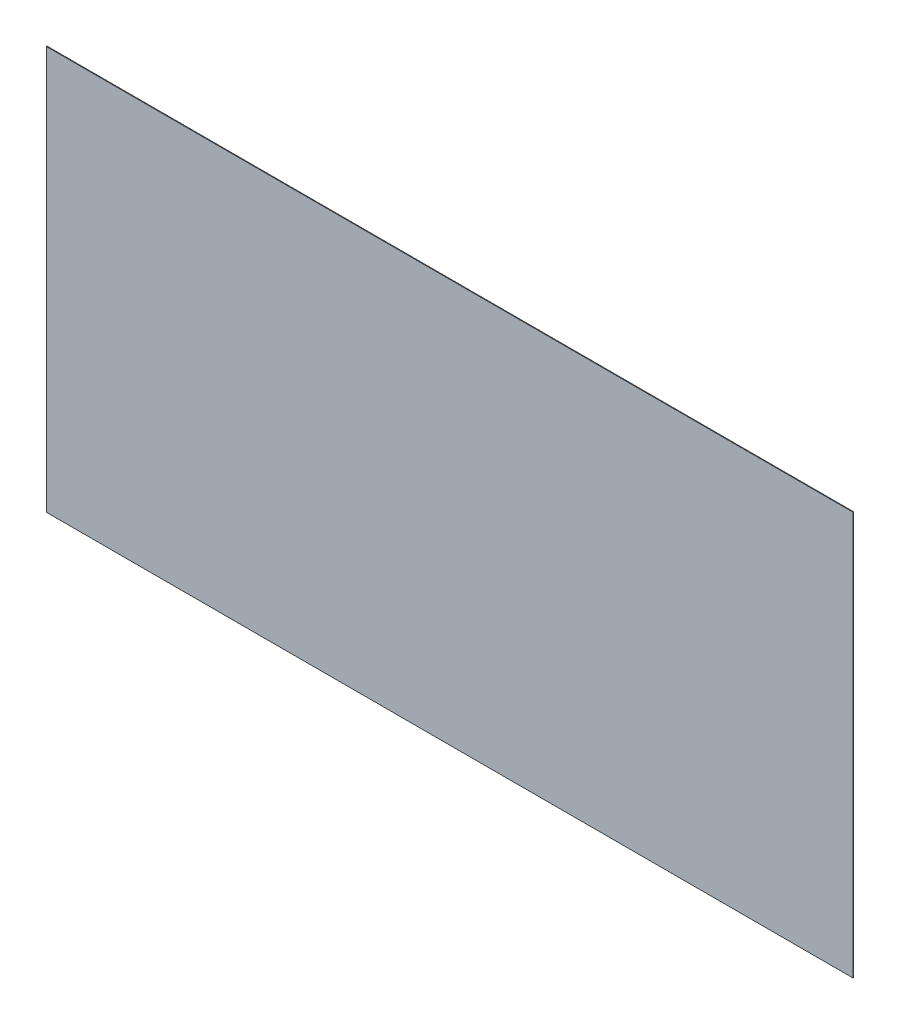
ISO-10303-21;
HEADER;
FILE_DESCRIPTION(('STEP AP214'),'2;1');
FILE_NAME('part.step','',(''),(''),'','','');
FILE_SCHEMA(('AUTOMOTIVE_DESIGN { 1 0 10303 214 1 1 1 1 }'));
ENDSEC;
DATA;
#1=APPLICATION_CONTEXT('core data for automotive mechanical design processes');
#2=APPLICATION_PROTOCOL_DEFINITION('international standard','automotive_design',2000,#1);
#3=PRODUCT_CONTEXT('',#1,'mechanical');
#4=PRODUCT('Part','Part','',(#3));
#5=PRODUCT_RELATED_PRODUCT_CATEGORY('part','',(#4));
#6=PRODUCT_DEFINITION_FORMATION('','',#4);
#7=PRODUCT_DEFINITION_CONTEXT('part definition',#1,'design');
#8=PRODUCT_DEFINITION('design','',#6,#7);
#9=PRODUCT_DEFINITION_SHAPE('','',#8);
#10=(LENGTH_UNIT() NAMED_UNIT(*) SI_UNIT(.MILLI.,.METRE.));
#11=(NAMED_UNIT(*) PLANE_ANGLE_UNIT() SI_UNIT($,.RADIAN.));
#12=(NAMED_UNIT(*) SI_UNIT($,.STERADIAN.) SOLID_ANGLE_UNIT());
#13=UNCERTAINTY_MEASURE_WITH_UNIT(LENGTH_MEASURE(1.E-05),#10,'distance_accuracy_value','');
#14=(GEOMETRIC_REPRESENTATION_CONTEXT(3) GLOBAL_UNCERTAINTY_ASSIGNED_CONTEXT((#13)) GLOBAL_UNIT_ASSIGNED_CONTEXT((#10,
#11,#12)) REPRESENTATION_CONTEXT('',''));
#15=CARTESIAN_POINT('',(0.,0.,0.));
#16=DIRECTION('',(0.,0.,1.));
#17=DIRECTION('',(1.,0.,0.));
#18=AXIS2_PLACEMENT_3D('',#15,#16,#17);
#19=CARTESIAN_POINT('',(914.4,-457.2,-0.79375));
#20=DIRECTION('',(1.,0.,0.));
#21=DIRECTION('',(0.,0.,-1.));
#22=AXIS2_PLACEMENT_3D('',#19,#20,#21);
#23=PLANE('',#22);
#24=DIRECTION('',(0.,0.,1.));
#25=VECTOR('',#24,1.);
#26=CARTESIAN_POINT('',(914.4,457.2,-0.79375));
#27=LINE('',#26,#25);
#28=CARTESIAN_POINT('',(914.4,457.2,-0.79375));
#29=VERTEX_POINT('',#28);
#30=CARTESIAN_POINT('',(914.4,457.2,0.79375));
#31=VERTEX_POINT('',#30);
#32=EDGE_CURVE('E42',#29,#31,#27,.T.);
#33=ORIENTED_EDGE('',*,*,#32,.T.);
#34=DIRECTION('',(0.,1.,0.));
#35=VECTOR('',#34,1.);
#36=CARTESIAN_POINT('',(914.4,-457.2,0.79375));
#37=LINE('',#36,#35);
#38=CARTESIAN_POINT('',(914.4,-457.2,0.79375));
#39=VERTEX_POINT('',#38);
#40=EDGE_CURVE('E80',#39,#31,#37,.T.);
#41=ORIENTED_EDGE('',*,*,#40,.F.);
#42=DIRECTION('',(0.,0.,1.));
#43=VECTOR('',#42,1.);
#44=CARTESIAN_POINT('',(914.4,-457.2,-0.79375));
#45=LINE('',#44,#43);
#46=CARTESIAN_POINT('',(914.4,-457.2,-0.79375));
#47=VERTEX_POINT('',#46);
#48=EDGE_CURVE('E11',#47,#39,#45,.T.);
#49=ORIENTED_EDGE('',*,*,#48,.F.);
#50=DIRECTION('',(0.,1.,0.));
#51=VECTOR('',#50,1.);
#52=CARTESIAN_POINT('',(914.4,-457.2,-0.79375));
#53=LINE('',#52,#51);
#54=EDGE_CURVE('E81',#47,#29,#53,.T.);
#55=ORIENTED_EDGE('',*,*,#54,.T.);
#56=EDGE_LOOP('',(#33,#41,#49,#55));
#57=FACE_BOUND('',#56,.T.);
#58=ADVANCED_FACE('F39',(#57),#23,.T.);
#59=CARTESIAN_POINT('',(-914.4,-457.2,-0.79375));
#60=DIRECTION('',(0.,-1.,0.));
#61=DIRECTION('',(0.,0.,-1.));
#62=AXIS2_PLACEMENT_3D('',#59,#60,#61);
#63=PLANE('',#62);
#64=ORIENTED_EDGE('',*,*,#48,.T.);
#65=DIRECTION('',(1.,0.,0.));
#66=VECTOR('',#65,1.);
#67=CARTESIAN_POINT('',(-914.4,-457.2,0.79375));
#68=LINE('',#67,#66);
#69=CARTESIAN_POINT('',(-914.4,-457.2,0.79375));
#70=VERTEX_POINT('',#69);
#71=EDGE_CURVE('E99',#70,#39,#68,.T.);
#72=ORIENTED_EDGE('',*,*,#71,.F.);
#73=DIRECTION('',(0.,0.,1.));
#74=VECTOR('',#73,1.);
#75=CARTESIAN_POINT('',(-914.4,-457.2,-0.79375));
#76=LINE('',#75,#74);
#77=CARTESIAN_POINT('',(-914.4,-457.2,-0.79375));
#78=VERTEX_POINT('',#77);
#79=EDGE_CURVE('E48',#78,#70,#76,.T.);
#80=ORIENTED_EDGE('',*,*,#79,.F.);
#81=DIRECTION('',(1.,0.,0.));
#82=VECTOR('',#81,1.);
#83=CARTESIAN_POINT('',(-914.4,-457.2,-0.79375));
#84=LINE('',#83,#82);
#85=EDGE_CURVE('E87',#78,#47,#84,.T.);
#86=ORIENTED_EDGE('',*,*,#85,.T.);
#87=EDGE_LOOP('',(#64,#72,#80,#86));
#88=FACE_BOUND('',#87,.T.);
#89=ADVANCED_FACE('F123',(#88),#63,.T.);
#90=CARTESIAN_POINT('',(-914.4,-457.2,-0.79375));
#91=DIRECTION('',(-1.,0.,0.));
#92=DIRECTION('',(0.,0.,1.));
#93=AXIS2_PLACEMENT_3D('',#90,#91,#92);
#94=PLANE('',#93);
#95=ORIENTED_EDGE('',*,*,#79,.T.);
#96=DIRECTION('',(0.,-1.,0.));
#97=VECTOR('',#96,1.);
#98=CARTESIAN_POINT('',(-914.4,-457.2,0.79375));
#99=LINE('',#98,#97);
#100=CARTESIAN_POINT('',(-914.4,457.2,0.79375));
#101=VERTEX_POINT('',#100);
#102=EDGE_CURVE('E95',#101,#70,#99,.T.);
#103=ORIENTED_EDGE('',*,*,#102,.F.);
#104=DIRECTION('',(0.,0.,1.));
#105=VECTOR('',#104,1.);
#106=CARTESIAN_POINT('',(-914.4,457.2,-0.79375));
#107=LINE('',#106,#105);
#108=CARTESIAN_POINT('',(-914.4,457.2,-0.79375));
#109=VERTEX_POINT('',#108);
#110=EDGE_CURVE('E86',#109,#101,#107,.T.);
#111=ORIENTED_EDGE('',*,*,#110,.F.);
#112=DIRECTION('',(0.,-1.,0.));
#113=VECTOR('',#112,1.);
#114=CARTESIAN_POINT('',(-914.4,-457.2,-0.79375));
#115=LINE('',#114,#113);
#116=EDGE_CURVE('E112',#109,#78,#115,.T.);
#117=ORIENTED_EDGE('',*,*,#116,.T.);
#118=EDGE_LOOP('',(#95,#103,#111,#117));
#119=FACE_BOUND('',#118,.T.);
#120=ADVANCED_FACE('F120',(#119),#94,.T.);
#121=CARTESIAN_POINT('',(-914.4,457.2,-0.79375));
#122=DIRECTION('',(0.,1.,0.));
#123=DIRECTION('',(0.,0.,1.));
#124=AXIS2_PLACEMENT_3D('',#121,#122,#123);
#125=PLANE('',#124);
#126=ORIENTED_EDGE('',*,*,#110,.T.);
#127=DIRECTION('',(-1.,0.,0.));
#128=VECTOR('',#127,1.);
#129=CARTESIAN_POINT('',(-914.4,457.2,0.79375));
#130=LINE('',#129,#128);
#131=EDGE_CURVE('E89',#31,#101,#130,.T.);
#132=ORIENTED_EDGE('',*,*,#131,.F.);
#133=ORIENTED_EDGE('',*,*,#32,.F.);
#134=DIRECTION('',(-1.,0.,0.));
#135=VECTOR('',#134,1.);
#136=CARTESIAN_POINT('',(-914.4,457.2,-0.79375));
#137=LINE('',#136,#135);
#138=EDGE_CURVE('E109',#29,#109,#137,.T.);
#139=ORIENTED_EDGE('',*,*,#138,.T.);
#140=EDGE_LOOP('',(#126,#132,#133,#139));
#141=FACE_BOUND('',#140,.T.);
#142=ADVANCED_FACE('F90',(#141),#125,.T.);
#143=CARTESIAN_POINT('',(0.,0.,-0.79375));
#144=DIRECTION('',(0.,0.,-1.));
#145=DIRECTION('',(-1.,0.,0.));
#146=AXIS2_PLACEMENT_3D('',#143,#144,#145);
#147=PLANE('',#146);
#148=ORIENTED_EDGE('',*,*,#54,.F.);
#149=ORIENTED_EDGE('',*,*,#85,.F.);
#150=ORIENTED_EDGE('',*,*,#116,.F.);
#151=ORIENTED_EDGE('',*,*,#138,.F.);
#152=EDGE_LOOP('',(#148,#149,#150,#151));
#153=FACE_BOUND('',#152,.T.);
#154=ADVANCED_FACE('F125',(#153),#147,.T.);
#155=CARTESIAN_POINT('',(0.,0.,0.79375));
#156=DIRECTION('',(0.,0.,-1.));
#157=DIRECTION('',(-1.,0.,0.));
#158=AXIS2_PLACEMENT_3D('',#155,#156,#157);
#159=PLANE('',#158);
#160=ORIENTED_EDGE('',*,*,#40,.T.);
#161=ORIENTED_EDGE('',*,*,#131,.T.);
#162=ORIENTED_EDGE('',*,*,#102,.T.);
#163=ORIENTED_EDGE('',*,*,#71,.T.);
#164=EDGE_LOOP('',(#160,#161,#162,#163));
#165=FACE_BOUND('',#164,.T.);
#166=ADVANCED_FACE('F98',(#165),#159,.F.);
#167=CLOSED_SHELL('',(#58,#89,#120,#142,#154,#166));
#168=MANIFOLD_SOLID_BREP('B2',#167);
#169=ADVANCED_BREP_SHAPE_REPRESENTATION('',(#18,#168),#14);
#170=SHAPE_DEFINITION_REPRESENTATION(#9,#169);
ENDSEC;
END-ISO-10303-21;
